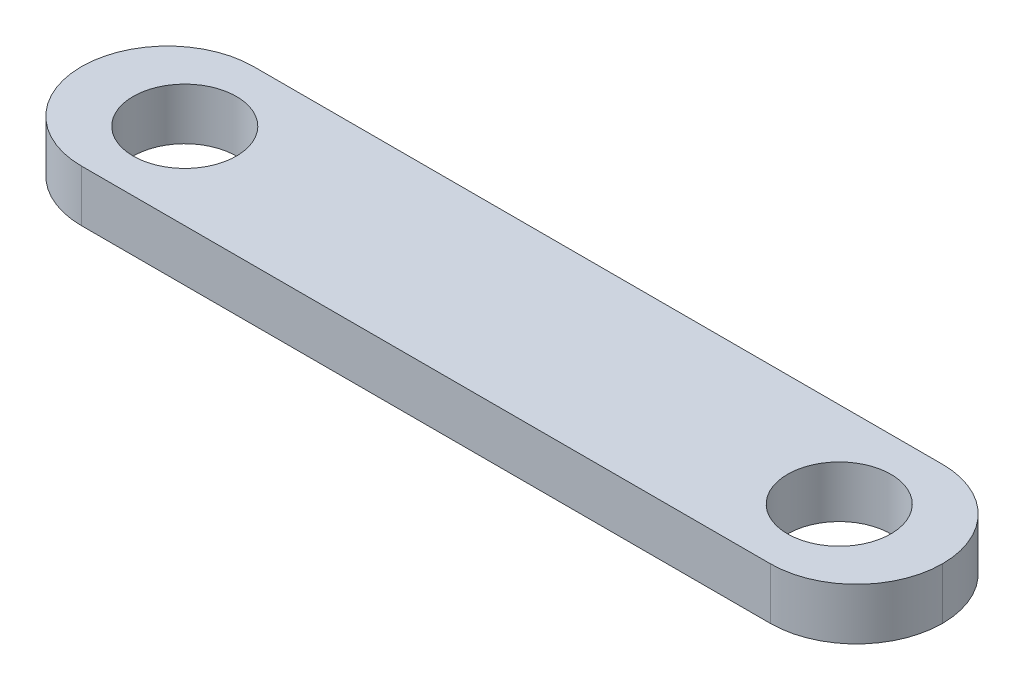
ISO-10303-21;
HEADER;
FILE_DESCRIPTION(('STEP AP214'),'2;1');
FILE_NAME('part.step','',(''),(''),'','','');
FILE_SCHEMA(('AUTOMOTIVE_DESIGN { 1 0 10303 214 1 1 1 1 }'));
ENDSEC;
DATA;
#1=APPLICATION_CONTEXT('core data for automotive mechanical design processes');
#2=APPLICATION_PROTOCOL_DEFINITION('international standard','automotive_design',2000,#1);
#3=PRODUCT_CONTEXT('',#1,'mechanical');
#4=PRODUCT('Part','Part','',(#3));
#5=PRODUCT_RELATED_PRODUCT_CATEGORY('part','',(#4));
#6=PRODUCT_DEFINITION_FORMATION('','',#4);
#7=PRODUCT_DEFINITION_CONTEXT('part definition',#1,'design');
#8=PRODUCT_DEFINITION('design','',#6,#7);
#9=PRODUCT_DEFINITION_SHAPE('','',#8);
#10=(LENGTH_UNIT() NAMED_UNIT(*) SI_UNIT(.MILLI.,.METRE.));
#11=(NAMED_UNIT(*) PLANE_ANGLE_UNIT() SI_UNIT($,.RADIAN.));
#12=(NAMED_UNIT(*) SI_UNIT($,.STERADIAN.) SOLID_ANGLE_UNIT());
#13=UNCERTAINTY_MEASURE_WITH_UNIT(LENGTH_MEASURE(1.E-05),#10,'distance_accuracy_value','');
#14=(GEOMETRIC_REPRESENTATION_CONTEXT(3) GLOBAL_UNCERTAINTY_ASSIGNED_CONTEXT((#13)) GLOBAL_UNIT_ASSIGNED_CONTEXT((#10,
#11,#12)) REPRESENTATION_CONTEXT('',''));
#15=CARTESIAN_POINT('',(0.,0.,0.));
#16=DIRECTION('',(0.,0.,1.));
#17=DIRECTION('',(1.,0.,0.));
#18=AXIS2_PLACEMENT_3D('',#15,#16,#17);
#19=CARTESIAN_POINT('',(0.,3.,0.));
#20=DIRECTION('',(0.,0.,-1.));
#21=DIRECTION('',(-1.,0.,0.));
#22=AXIS2_PLACEMENT_3D('',#19,#20,#21);
#23=PLANE('',#22);
#24=DIRECTION('',(1.,0.,0.));
#25=VECTOR('',#24,1.);
#26=CARTESIAN_POINT('',(0.,0.,0.));
#27=LINE('',#26,#25);
#28=CARTESIAN_POINT('',(5.,0.,0.));
#29=VERTEX_POINT('',#28);
#30=CARTESIAN_POINT('',(45.,0.,0.));
#31=VERTEX_POINT('',#30);
#32=EDGE_CURVE('E99',#29,#31,#27,.T.);
#33=ORIENTED_EDGE('',*,*,#32,.T.);
#34=DIRECTION('',(0.,-1.,0.));
#35=VECTOR('',#34,1.);
#36=CARTESIAN_POINT('',(45.,3.,0.));
#37=LINE('',#36,#35);
#38=CARTESIAN_POINT('',(45.,3.,0.));
#39=VERTEX_POINT('',#38);
#40=EDGE_CURVE('E11',#31,#39,#37,.F.);
#41=ORIENTED_EDGE('',*,*,#40,.T.);
#42=DIRECTION('',(1.,0.,0.));
#43=VECTOR('',#42,1.);
#44=CARTESIAN_POINT('',(0.,3.,0.));
#45=LINE('',#44,#43);
#46=CARTESIAN_POINT('',(5.,3.,0.));
#47=VERTEX_POINT('',#46);
#48=EDGE_CURVE('E140',#47,#39,#45,.T.);
#49=ORIENTED_EDGE('',*,*,#48,.F.);
#50=DIRECTION('',(0.,-1.,0.));
#51=VECTOR('',#50,1.);
#52=CARTESIAN_POINT('',(5.,3.,0.));
#53=LINE('',#52,#51);
#54=EDGE_CURVE('E122',#47,#29,#53,.T.);
#55=ORIENTED_EDGE('',*,*,#54,.T.);
#56=EDGE_LOOP('',(#33,#41,#49,#55));
#57=FACE_BOUND('',#56,.T.);
#58=ADVANCED_FACE('F37',(#57),#23,.F.);
#59=CARTESIAN_POINT('',(0.,3.,-10.));
#60=DIRECTION('',(0.,0.,1.));
#61=DIRECTION('',(1.,0.,0.));
#62=AXIS2_PLACEMENT_3D('',#59,#60,#61);
#63=PLANE('',#62);
#64=DIRECTION('',(-1.,0.,0.));
#65=VECTOR('',#64,1.);
#66=CARTESIAN_POINT('',(0.,3.,-10.));
#67=LINE('',#66,#65);
#68=CARTESIAN_POINT('',(45.,3.,-10.));
#69=VERTEX_POINT('',#68);
#70=CARTESIAN_POINT('',(5.,3.,-10.));
#71=VERTEX_POINT('',#70);
#72=EDGE_CURVE('E102',#69,#71,#67,.T.);
#73=ORIENTED_EDGE('',*,*,#72,.F.);
#74=DIRECTION('',(0.,-1.,0.));
#75=VECTOR('',#74,1.);
#76=CARTESIAN_POINT('',(45.,3.,-10.));
#77=LINE('',#76,#75);
#78=CARTESIAN_POINT('',(45.,0.,-10.));
#79=VERTEX_POINT('',#78);
#80=EDGE_CURVE('E123',#69,#79,#77,.T.);
#81=ORIENTED_EDGE('',*,*,#80,.T.);
#82=DIRECTION('',(-1.,0.,0.));
#83=VECTOR('',#82,1.);
#84=CARTESIAN_POINT('',(0.,0.,-10.));
#85=LINE('',#84,#83);
#86=CARTESIAN_POINT('',(5.,0.,-10.));
#87=VERTEX_POINT('',#86);
#88=EDGE_CURVE('E144',#79,#87,#85,.T.);
#89=ORIENTED_EDGE('',*,*,#88,.T.);
#90=DIRECTION('',(0.,-1.,0.));
#91=VECTOR('',#90,1.);
#92=CARTESIAN_POINT('',(5.,3.,-10.));
#93=LINE('',#92,#91);
#94=EDGE_CURVE('E114',#87,#71,#93,.F.);
#95=ORIENTED_EDGE('',*,*,#94,.T.);
#96=EDGE_LOOP('',(#73,#81,#89,#95));
#97=FACE_BOUND('',#96,.T.);
#98=ADVANCED_FACE('F139',(#97),#63,.F.);
#99=CARTESIAN_POINT('',(0.,3.,0.));
#100=DIRECTION('',(0.,-1.,0.));
#101=DIRECTION('',(0.,0.,-1.));
#102=AXIS2_PLACEMENT_3D('',#99,#100,#101);
#103=PLANE('',#102);
#104=CARTESIAN_POINT('',(44.,3.,-5.));
#105=DIRECTION('',(0.,1.,0.));
#106=DIRECTION('',(0.,0.,1.));
#107=AXIS2_PLACEMENT_3D('',#104,#105,#106);
#108=CIRCLE('',#107,3.00000000000001);
#109=CARTESIAN_POINT('',(44.,3.,-1.99999999999999));
#110=VERTEX_POINT('',#109);
#111=EDGE_CURVE('E156',#110,#110,#108,.T.);
#112=ORIENTED_EDGE('',*,*,#111,.F.);
#113=EDGE_LOOP('',(#112));
#114=FACE_BOUND('',#113,.T.);
#115=CARTESIAN_POINT('',(6.,3.,-5.));
#116=DIRECTION('',(0.,1.,0.));
#117=DIRECTION('',(0.,0.,1.));
#118=AXIS2_PLACEMENT_3D('',#115,#116,#117);
#119=CIRCLE('',#118,3.);
#120=CARTESIAN_POINT('',(6.,3.,-2.));
#121=VERTEX_POINT('',#120);
#122=EDGE_CURVE('E148',#121,#121,#119,.T.);
#123=ORIENTED_EDGE('',*,*,#122,.F.);
#124=EDGE_LOOP('',(#123));
#125=FACE_BOUND('',#124,.T.);
#126=CARTESIAN_POINT('',(45.,3.,-5.));
#127=DIRECTION('',(0.,-1.,0.));
#128=DIRECTION('',(0.,0.,-1.));
#129=AXIS2_PLACEMENT_3D('',#126,#127,#128);
#130=CIRCLE('',#129,5.);
#131=CARTESIAN_POINT('',(50.,3.,-5.));
#132=VERTEX_POINT('',#131);
#133=EDGE_CURVE('E53',#39,#132,#130,.F.);
#134=ORIENTED_EDGE('',*,*,#133,.T.);
#135=CARTESIAN_POINT('',(45.,3.,-5.));
#136=DIRECTION('',(0.,-1.,0.));
#137=DIRECTION('',(0.,0.,-1.));
#138=AXIS2_PLACEMENT_3D('',#135,#136,#137);
#139=CIRCLE('',#138,5.);
#140=EDGE_CURVE('E46',#132,#69,#139,.F.);
#141=ORIENTED_EDGE('',*,*,#140,.T.);
#142=ORIENTED_EDGE('',*,*,#72,.T.);
#143=CARTESIAN_POINT('',(5.,3.,-5.));
#144=DIRECTION('',(0.,-1.,0.));
#145=DIRECTION('',(0.,0.,-1.));
#146=AXIS2_PLACEMENT_3D('',#143,#144,#145);
#147=CIRCLE('',#146,5.);
#148=CARTESIAN_POINT('',(0.,3.,-5.));
#149=VERTEX_POINT('',#148);
#150=EDGE_CURVE('E120',#71,#149,#147,.F.);
#151=ORIENTED_EDGE('',*,*,#150,.T.);
#152=CARTESIAN_POINT('',(5.,3.,-5.));
#153=DIRECTION('',(0.,-1.,0.));
#154=DIRECTION('',(0.,0.,-1.));
#155=AXIS2_PLACEMENT_3D('',#152,#153,#154);
#156=CIRCLE('',#155,5.);
#157=EDGE_CURVE('E108',#149,#47,#156,.F.);
#158=ORIENTED_EDGE('',*,*,#157,.T.);
#159=ORIENTED_EDGE('',*,*,#48,.T.);
#160=EDGE_LOOP('',(#134,#141,#142,#151,#158,#159));
#161=FACE_BOUND('',#160,.T.);
#162=ADVANCED_FACE('F134',(#114,#125,#161),#103,.F.);
#163=CARTESIAN_POINT('',(0.,0.,0.));
#164=DIRECTION('',(0.,-1.,0.));
#165=DIRECTION('',(0.,0.,-1.));
#166=AXIS2_PLACEMENT_3D('',#163,#164,#165);
#167=PLANE('',#166);
#168=CARTESIAN_POINT('',(44.,0.,-5.));
#169=DIRECTION('',(0.,1.,0.));
#170=DIRECTION('',(0.,0.,1.));
#171=AXIS2_PLACEMENT_3D('',#168,#169,#170);
#172=CIRCLE('',#171,3.00000000000001);
#173=CARTESIAN_POINT('',(44.,0.,-1.99999999999999));
#174=VERTEX_POINT('',#173);
#175=EDGE_CURVE('E153',#174,#174,#172,.T.);
#176=ORIENTED_EDGE('',*,*,#175,.T.);
#177=EDGE_LOOP('',(#176));
#178=FACE_BOUND('',#177,.T.);
#179=CARTESIAN_POINT('',(6.,0.,-5.));
#180=DIRECTION('',(0.,1.,0.));
#181=DIRECTION('',(0.,0.,1.));
#182=AXIS2_PLACEMENT_3D('',#179,#180,#181);
#183=CIRCLE('',#182,3.);
#184=CARTESIAN_POINT('',(6.,0.,-2.));
#185=VERTEX_POINT('',#184);
#186=EDGE_CURVE('E146',#185,#185,#183,.T.);
#187=ORIENTED_EDGE('',*,*,#186,.T.);
#188=EDGE_LOOP('',(#187));
#189=FACE_BOUND('',#188,.T.);
#190=ORIENTED_EDGE('',*,*,#88,.F.);
#191=CARTESIAN_POINT('',(45.,0.,-5.));
#192=DIRECTION('',(0.,-1.,0.));
#193=DIRECTION('',(0.,0.,-1.));
#194=AXIS2_PLACEMENT_3D('',#191,#192,#193);
#195=CIRCLE('',#194,5.);
#196=CARTESIAN_POINT('',(50.,0.,-5.));
#197=VERTEX_POINT('',#196);
#198=EDGE_CURVE('E129',#79,#197,#195,.T.);
#199=ORIENTED_EDGE('',*,*,#198,.T.);
#200=CARTESIAN_POINT('',(45.,0.,-5.));
#201=DIRECTION('',(0.,-1.,0.));
#202=DIRECTION('',(0.,0.,-1.));
#203=AXIS2_PLACEMENT_3D('',#200,#201,#202);
#204=CIRCLE('',#203,5.);
#205=EDGE_CURVE('E127',#197,#31,#204,.T.);
#206=ORIENTED_EDGE('',*,*,#205,.T.);
#207=ORIENTED_EDGE('',*,*,#32,.F.);
#208=CARTESIAN_POINT('',(5.,0.,-5.));
#209=DIRECTION('',(0.,-1.,0.));
#210=DIRECTION('',(0.,0.,-1.));
#211=AXIS2_PLACEMENT_3D('',#208,#209,#210);
#212=CIRCLE('',#211,5.);
#213=CARTESIAN_POINT('',(0.,0.,-5.));
#214=VERTEX_POINT('',#213);
#215=EDGE_CURVE('E92',#29,#214,#212,.T.);
#216=ORIENTED_EDGE('',*,*,#215,.T.);
#217=CARTESIAN_POINT('',(5.,0.,-5.));
#218=DIRECTION('',(0.,-1.,0.));
#219=DIRECTION('',(0.,0.,-1.));
#220=AXIS2_PLACEMENT_3D('',#217,#218,#219);
#221=CIRCLE('',#220,5.);
#222=EDGE_CURVE('E97',#214,#87,#221,.T.);
#223=ORIENTED_EDGE('',*,*,#222,.T.);
#224=EDGE_LOOP('',(#190,#199,#206,#207,#216,#223));
#225=FACE_BOUND('',#224,.T.);
#226=ADVANCED_FACE('F95',(#178,#189,#225),#167,.T.);
#227=CARTESIAN_POINT('',(5.,3.,-5.));
#228=DIRECTION('',(0.,-1.,0.));
#229=DIRECTION('',(0.,0.,-1.));
#230=AXIS2_PLACEMENT_3D('',#227,#228,#229);
#231=CYLINDRICAL_SURFACE('',#230,5.);
#232=ORIENTED_EDGE('',*,*,#54,.F.);
#233=ORIENTED_EDGE('',*,*,#157,.F.);
#234=DIRECTION('',(0.,-1.,0.));
#235=VECTOR('',#234,1.);
#236=CARTESIAN_POINT('',(0.,3.,-5.));
#237=LINE('',#236,#235);
#238=EDGE_CURVE('E106',#214,#149,#237,.F.);
#239=ORIENTED_EDGE('',*,*,#238,.F.);
#240=ORIENTED_EDGE('',*,*,#215,.F.);
#241=EDGE_LOOP('',(#232,#233,#239,#240));
#242=FACE_BOUND('',#241,.T.);
#243=ADVANCED_FACE('F107',(#242),#231,.T.);
#244=CARTESIAN_POINT('',(5.,3.,-5.));
#245=DIRECTION('',(0.,-1.,0.));
#246=DIRECTION('',(0.,0.,-1.));
#247=AXIS2_PLACEMENT_3D('',#244,#245,#246);
#248=CYLINDRICAL_SURFACE('',#247,5.);
#249=ORIENTED_EDGE('',*,*,#150,.F.);
#250=ORIENTED_EDGE('',*,*,#94,.F.);
#251=ORIENTED_EDGE('',*,*,#222,.F.);
#252=ORIENTED_EDGE('',*,*,#238,.T.);
#253=EDGE_LOOP('',(#249,#250,#251,#252));
#254=FACE_BOUND('',#253,.T.);
#255=ADVANCED_FACE('F112',(#254),#248,.T.);
#256=CARTESIAN_POINT('',(45.,3.,-5.));
#257=DIRECTION('',(0.,-1.,0.));
#258=DIRECTION('',(0.,0.,-1.));
#259=AXIS2_PLACEMENT_3D('',#256,#257,#258);
#260=CYLINDRICAL_SURFACE('',#259,5.);
#261=DIRECTION('',(0.,-1.,0.));
#262=VECTOR('',#261,1.);
#263=CARTESIAN_POINT('',(50.,3.,-5.));
#264=LINE('',#263,#262);
#265=EDGE_CURVE('E41',#132,#197,#264,.T.);
#266=ORIENTED_EDGE('',*,*,#265,.F.);
#267=ORIENTED_EDGE('',*,*,#133,.F.);
#268=ORIENTED_EDGE('',*,*,#40,.F.);
#269=ORIENTED_EDGE('',*,*,#205,.F.);
#270=EDGE_LOOP('',(#266,#267,#268,#269));
#271=FACE_BOUND('',#270,.T.);
#272=ADVANCED_FACE('F39',(#271),#260,.T.);
#273=CARTESIAN_POINT('',(45.,3.,-5.));
#274=DIRECTION('',(0.,-1.,0.));
#275=DIRECTION('',(0.,0.,-1.));
#276=AXIS2_PLACEMENT_3D('',#273,#274,#275);
#277=CYLINDRICAL_SURFACE('',#276,5.);
#278=ORIENTED_EDGE('',*,*,#140,.F.);
#279=ORIENTED_EDGE('',*,*,#265,.T.);
#280=ORIENTED_EDGE('',*,*,#198,.F.);
#281=ORIENTED_EDGE('',*,*,#80,.F.);
#282=EDGE_LOOP('',(#278,#279,#280,#281));
#283=FACE_BOUND('',#282,.T.);
#284=ADVANCED_FACE('F142',(#283),#277,.T.);
#285=CARTESIAN_POINT('',(6.,0.,-5.));
#286=DIRECTION('',(0.,1.,0.));
#287=DIRECTION('',(0.,0.,1.));
#288=AXIS2_PLACEMENT_3D('',#285,#286,#287);
#289=CYLINDRICAL_SURFACE('',#288,3.);
#290=ORIENTED_EDGE('',*,*,#186,.F.);
#291=EDGE_LOOP('',(#290));
#292=FACE_BOUND('',#291,.T.);
#293=ORIENTED_EDGE('',*,*,#122,.T.);
#294=EDGE_LOOP('',(#293));
#295=FACE_BOUND('',#294,.T.);
#296=ADVANCED_FACE('F172',(#292,#295),#289,.F.);
#297=CARTESIAN_POINT('',(44.,0.,-5.));
#298=DIRECTION('',(0.,1.,0.));
#299=DIRECTION('',(0.,0.,1.));
#300=AXIS2_PLACEMENT_3D('',#297,#298,#299);
#301=CYLINDRICAL_SURFACE('',#300,3.00000000000001);
#302=ORIENTED_EDGE('',*,*,#175,.F.);
#303=EDGE_LOOP('',(#302));
#304=FACE_BOUND('',#303,.T.);
#305=ORIENTED_EDGE('',*,*,#111,.T.);
#306=EDGE_LOOP('',(#305));
#307=FACE_BOUND('',#306,.T.);
#308=ADVANCED_FACE('F177',(#304,#307),#301,.F.);
#309=CLOSED_SHELL('',(#58,#98,#162,#226,#243,#255,#272,#284,#296,#308));
#310=MANIFOLD_SOLID_BREP('B2',#309);
#311=ADVANCED_BREP_SHAPE_REPRESENTATION('',(#18,#310),#14);
#312=SHAPE_DEFINITION_REPRESENTATION(#9,#311);
ENDSEC;
END-ISO-10303-21;
